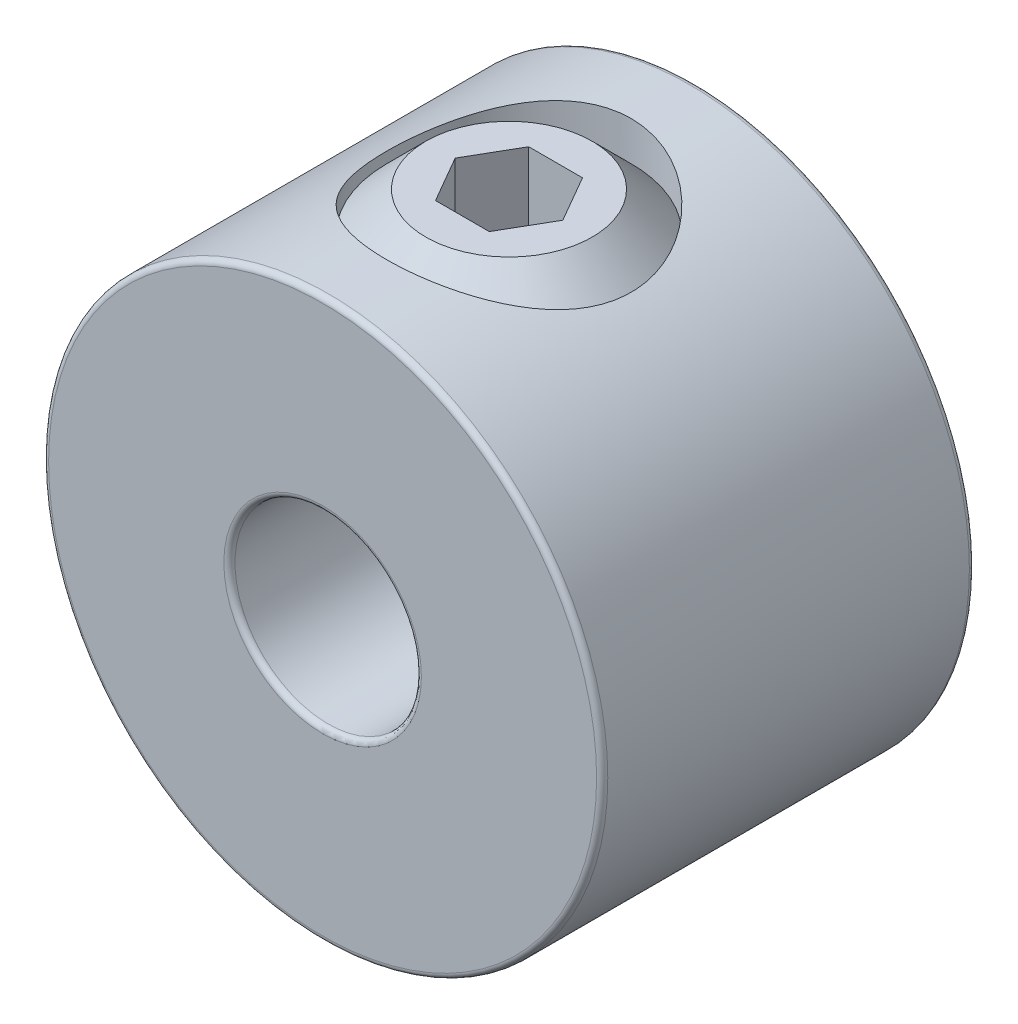
ISO-10303-21;
HEADER;
FILE_DESCRIPTION(('STEP AP214'),'2;1');
FILE_NAME('part.step','',(''),(''),'','','');
FILE_SCHEMA(('AUTOMOTIVE_DESIGN { 1 0 10303 214 1 1 1 1 }'));
ENDSEC;
DATA;
#1=APPLICATION_CONTEXT('core data for automotive mechanical design processes');
#2=APPLICATION_PROTOCOL_DEFINITION('international standard','automotive_design',2000,#1);
#3=PRODUCT_CONTEXT('',#1,'mechanical');
#4=PRODUCT('Part','Part','',(#3));
#5=PRODUCT_RELATED_PRODUCT_CATEGORY('part','',(#4));
#6=PRODUCT_DEFINITION_FORMATION('','',#4);
#7=PRODUCT_DEFINITION_CONTEXT('part definition',#1,'design');
#8=PRODUCT_DEFINITION('design','',#6,#7);
#9=PRODUCT_DEFINITION_SHAPE('','',#8);
#10=(LENGTH_UNIT() NAMED_UNIT(*) SI_UNIT(.MILLI.,.METRE.));
#11=(NAMED_UNIT(*) PLANE_ANGLE_UNIT() SI_UNIT($,.RADIAN.));
#12=(NAMED_UNIT(*) SI_UNIT($,.STERADIAN.) SOLID_ANGLE_UNIT());
#13=UNCERTAINTY_MEASURE_WITH_UNIT(LENGTH_MEASURE(1.E-05),#10,'distance_accuracy_value','');
#14=(GEOMETRIC_REPRESENTATION_CONTEXT(3) GLOBAL_UNCERTAINTY_ASSIGNED_CONTEXT((#13)) GLOBAL_UNIT_ASSIGNED_CONTEXT((#10,
#11,#12)) REPRESENTATION_CONTEXT('',''));
#15=CARTESIAN_POINT('',(0.,0.,0.));
#16=DIRECTION('',(0.,0.,1.));
#17=DIRECTION('',(1.,0.,0.));
#18=AXIS2_PLACEMENT_3D('',#15,#16,#17);
#19=CARTESIAN_POINT('',(0.,4.7625,0.));
#20=DIRECTION('',(0.,1.,0.));
#21=DIRECTION('',(-1.,0.,0.));
#22=AXIS2_PLACEMENT_3D('',#19,#20,#21);
#23=PLANE('',#22);
#24=CARTESIAN_POINT('',(0.,4.7625,0.));
#25=DIRECTION('',(0.,1.,0.));
#26=DIRECTION('',(-1.,0.,0.));
#27=AXIS2_PLACEMENT_3D('',#24,#25,#26);
#28=CIRCLE('',#27,1.41636774419345);
#29=CARTESIAN_POINT('',(-1.41636774419345,4.7625,0.));
#30=VERTEX_POINT('',#29);
#31=EDGE_CURVE('E12',#30,#30,#28,.T.);
#32=ORIENTED_EDGE('',*,*,#31,.T.);
#33=EDGE_LOOP('',(#32));
#34=FACE_BOUND('',#33,.T.);
#35=DIRECTION('',(1.,0.,0.));
#36=VECTOR('',#35,1.);
#37=CARTESIAN_POINT('',(-0.458271776169267,4.76249999999999,-0.793749999999997));
#38=LINE('',#37,#36);
#39=CARTESIAN_POINT('',(-0.458271776169267,4.76249999999999,-0.793749999999997));
#40=VERTEX_POINT('',#39);
#41=CARTESIAN_POINT('',(0.458271776169265,4.7625,-0.793749999999997));
#42=VERTEX_POINT('',#41);
#43=EDGE_CURVE('E117',#40,#42,#38,.T.);
#44=ORIENTED_EDGE('',*,*,#43,.T.);
#45=DIRECTION('',(0.5,0.,0.866025403784439));
#46=VECTOR('',#45,1.);
#47=CARTESIAN_POINT('',(0.458271776169265,4.76249999999999,-0.793749999999997));
#48=LINE('',#47,#46);
#49=CARTESIAN_POINT('',(0.91654355233853,4.76249999999999,0.));
#50=VERTEX_POINT('',#49);
#51=EDGE_CURVE('E63',#42,#50,#48,.T.);
#52=ORIENTED_EDGE('',*,*,#51,.T.);
#53=DIRECTION('',(-0.5,0.,0.866025403784439));
#54=VECTOR('',#53,1.);
#55=CARTESIAN_POINT('',(0.91654355233853,4.76249999999999,0.));
#56=LINE('',#55,#54);
#57=CARTESIAN_POINT('',(0.458271776169265,4.76249999999999,0.793750000000003));
#58=VERTEX_POINT('',#57);
#59=EDGE_CURVE('E121',#50,#58,#56,.T.);
#60=ORIENTED_EDGE('',*,*,#59,.T.);
#61=DIRECTION('',(-1.,0.,0.));
#62=VECTOR('',#61,1.);
#63=CARTESIAN_POINT('',(0.458271776169265,4.76249999999999,0.793750000000003));
#64=LINE('',#63,#62);
#65=CARTESIAN_POINT('',(-0.458271776169266,4.76249999999999,0.793750000000002));
#66=VERTEX_POINT('',#65);
#67=EDGE_CURVE('E186',#58,#66,#64,.T.);
#68=ORIENTED_EDGE('',*,*,#67,.T.);
#69=DIRECTION('',(-0.5,0.,-0.866025403784438));
#70=VECTOR('',#69,1.);
#71=CARTESIAN_POINT('',(-0.458271776169266,4.76249999999999,0.793750000000002));
#72=LINE('',#71,#70);
#73=CARTESIAN_POINT('',(-0.916543552338532,4.76249999999999,0.));
#74=VERTEX_POINT('',#73);
#75=EDGE_CURVE('E171',#66,#74,#72,.T.);
#76=ORIENTED_EDGE('',*,*,#75,.T.);
#77=DIRECTION('',(0.5,0.,-0.866025403784439));
#78=VECTOR('',#77,1.);
#79=CARTESIAN_POINT('',(-0.916543552338532,4.76249999999999,0.));
#80=LINE('',#79,#78);
#81=EDGE_CURVE('E167',#74,#40,#80,.T.);
#82=ORIENTED_EDGE('',*,*,#81,.T.);
#83=EDGE_LOOP('',(#44,#52,#60,#68,#76,#82));
#84=FACE_BOUND('',#83,.T.);
#85=ADVANCED_FACE('F49',(#34,#84),#23,.T.);
#86=CARTESIAN_POINT('',(0.,4.7625,0.));
#87=DIRECTION('',(0.,-1.,0.));
#88=DIRECTION('',(1.,0.,0.));
#89=AXIS2_PLACEMENT_3D('',#86,#87,#88);
#90=CONICAL_SURFACE('',#89,1.41636774419345,0.785398163397449);
#91=CARTESIAN_POINT('',(0.,4.09606774419345,0.));
#92=DIRECTION('',(0.,1.,0.));
#93=DIRECTION('',(-1.,0.,0.));
#94=AXIS2_PLACEMENT_3D('',#91,#92,#93);
#95=CIRCLE('',#94,2.0828);
#96=CARTESIAN_POINT('',(-2.0828,4.09606774419345,0.));
#97=VERTEX_POINT('',#96);
#98=EDGE_CURVE('E56',#97,#97,#95,.T.);
#99=ORIENTED_EDGE('',*,*,#98,.T.);
#100=EDGE_LOOP('',(#99));
#101=FACE_BOUND('',#100,.T.);
#102=ORIENTED_EDGE('',*,*,#31,.F.);
#103=EDGE_LOOP('',(#102));
#104=FACE_BOUND('',#103,.T.);
#105=ADVANCED_FACE('F139',(#101,#104),#90,.T.);
#106=CARTESIAN_POINT('',(0.,1.5875,0.));
#107=DIRECTION('',(0.,1.,0.));
#108=DIRECTION('',(-1.,0.,0.));
#109=AXIS2_PLACEMENT_3D('',#106,#107,#108);
#110=CYLINDRICAL_SURFACE('',#109,2.0828);
#111=CARTESIAN_POINT('',(0.,2.25393225580655,0.));
#112=DIRECTION('',(0.,1.,0.));
#113=DIRECTION('',(-1.,0.,0.));
#114=AXIS2_PLACEMENT_3D('',#111,#112,#113);
#115=CIRCLE('',#114,2.0828);
#116=CARTESIAN_POINT('',(-2.0828,2.25393225580655,0.));
#117=VERTEX_POINT('',#116);
#118=EDGE_CURVE('E134',#117,#117,#115,.T.);
#119=ORIENTED_EDGE('',*,*,#118,.T.);
#120=EDGE_LOOP('',(#119));
#121=FACE_BOUND('',#120,.T.);
#122=ORIENTED_EDGE('',*,*,#98,.F.);
#123=EDGE_LOOP('',(#122));
#124=FACE_BOUND('',#123,.T.);
#125=ADVANCED_FACE('F142',(#121,#124),#110,.T.);
#126=CARTESIAN_POINT('',(0.,2.25393225580655,0.));
#127=DIRECTION('',(0.,1.,0.));
#128=DIRECTION('',(-1.,0.,0.));
#129=AXIS2_PLACEMENT_3D('',#126,#127,#128);
#130=CONICAL_SURFACE('',#129,2.0828,0.785398163397448);
#131=CARTESIAN_POINT('',(0.,1.5875,0.));
#132=DIRECTION('',(0.,1.,0.));
#133=DIRECTION('',(-1.,0.,0.));
#134=AXIS2_PLACEMENT_3D('',#131,#132,#133);
#135=CIRCLE('',#134,1.41636774419345);
#136=CARTESIAN_POINT('',(-1.41636774419345,1.5875,0.));
#137=VERTEX_POINT('',#136);
#138=EDGE_CURVE('E126',#137,#137,#135,.T.);
#139=ORIENTED_EDGE('',*,*,#138,.T.);
#140=EDGE_LOOP('',(#139));
#141=FACE_BOUND('',#140,.T.);
#142=ORIENTED_EDGE('',*,*,#118,.F.);
#143=EDGE_LOOP('',(#142));
#144=FACE_BOUND('',#143,.T.);
#145=ADVANCED_FACE('F144',(#141,#144),#130,.T.);
#146=CARTESIAN_POINT('',(-1.41636774419345,1.5875,0.));
#147=DIRECTION('',(0.,-1.,0.));
#148=DIRECTION('',(1.,0.,0.));
#149=AXIS2_PLACEMENT_3D('',#146,#147,#148);
#150=PLANE('',#149);
#151=CARTESIAN_POINT('',(0.,1.5875,0.));
#152=DIRECTION('',(0.,1.,0.));
#153=DIRECTION('',(-1.,0.,0.));
#154=AXIS2_PLACEMENT_3D('',#151,#152,#153);
#155=CIRCLE('',#154,0.799718706967865);
#156=CARTESIAN_POINT('',(-0.799718706967865,1.5875,0.));
#157=VERTEX_POINT('',#156);
#158=EDGE_CURVE('E122',#157,#157,#155,.T.);
#159=ORIENTED_EDGE('',*,*,#158,.T.);
#160=EDGE_LOOP('',(#159));
#161=FACE_BOUND('',#160,.T.);
#162=ORIENTED_EDGE('',*,*,#138,.F.);
#163=EDGE_LOOP('',(#162));
#164=FACE_BOUND('',#163,.T.);
#165=ADVANCED_FACE('F151',(#161,#164),#150,.T.);
#166=CARTESIAN_POINT('',(0.,1.5875,0.));
#167=DIRECTION('',(0.,-1.,0.));
#168=DIRECTION('',(1.,0.,0.));
#169=AXIS2_PLACEMENT_3D('',#166,#167,#168);
#170=CONICAL_SURFACE('',#169,0.799718706967865,0.785398163397448);
#171=CARTESIAN_POINT('',(0.,2.38721870696786,0.));
#172=VERTEX_POINT('',#171);
#173=VERTEX_LOOP('',#172);
#174=FACE_BOUND('',#173,.T.);
#175=ORIENTED_EDGE('',*,*,#158,.F.);
#176=EDGE_LOOP('',(#175));
#177=FACE_BOUND('',#176,.T.);
#178=ADVANCED_FACE('F219',(#174,#177),#170,.F.);
#179=CARTESIAN_POINT('',(0.458271776169265,3.17499999999999,-0.793749999999997));
#180=DIRECTION('',(-0.866025403784439,0.,0.5));
#181=DIRECTION('',(0.5,0.,0.866025403784439));
#182=AXIS2_PLACEMENT_3D('',#179,#180,#181);
#183=PLANE('',#182);
#184=ORIENTED_EDGE('',*,*,#51,.F.);
#185=DIRECTION('',(0.,1.,0.));
#186=VECTOR('',#185,1.);
#187=CARTESIAN_POINT('',(0.458271776169265,3.17499999999999,-0.793749999999997));
#188=LINE('',#187,#186);
#189=CARTESIAN_POINT('',(0.458271776169265,3.17499999999999,-0.793749999999997));
#190=VERTEX_POINT('',#189);
#191=EDGE_CURVE('E116',#190,#42,#188,.T.);
#192=ORIENTED_EDGE('',*,*,#191,.F.);
#193=DIRECTION('',(0.5,0.,0.866025403784439));
#194=VECTOR('',#193,1.);
#195=CARTESIAN_POINT('',(0.458271776169265,3.17499999999999,-0.793749999999997));
#196=LINE('',#195,#194);
#197=CARTESIAN_POINT('',(0.91654355233853,3.17499999999999,0.));
#198=VERTEX_POINT('',#197);
#199=EDGE_CURVE('E107',#190,#198,#196,.T.);
#200=ORIENTED_EDGE('',*,*,#199,.T.);
#201=DIRECTION('',(0.,1.,0.));
#202=VECTOR('',#201,1.);
#203=CARTESIAN_POINT('',(0.91654355233853,3.17499999999999,0.));
#204=LINE('',#203,#202);
#205=EDGE_CURVE('E115',#198,#50,#204,.T.);
#206=ORIENTED_EDGE('',*,*,#205,.T.);
#207=EDGE_LOOP('',(#184,#192,#200,#206));
#208=FACE_BOUND('',#207,.T.);
#209=ADVANCED_FACE('F114',(#208),#183,.T.);
#210=CARTESIAN_POINT('',(0.91654355233853,3.17499999999999,0.));
#211=DIRECTION('',(-0.866025403784439,0.,-0.5));
#212=DIRECTION('',(-0.5,0.,0.866025403784439));
#213=AXIS2_PLACEMENT_3D('',#210,#211,#212);
#214=PLANE('',#213);
#215=ORIENTED_EDGE('',*,*,#59,.F.);
#216=ORIENTED_EDGE('',*,*,#205,.F.);
#217=DIRECTION('',(-0.5,0.,0.866025403784439));
#218=VECTOR('',#217,1.);
#219=CARTESIAN_POINT('',(0.91654355233853,3.17499999999999,0.));
#220=LINE('',#219,#218);
#221=CARTESIAN_POINT('',(0.458271776169265,3.17499999999999,0.793750000000003));
#222=VERTEX_POINT('',#221);
#223=EDGE_CURVE('E103',#198,#222,#220,.T.);
#224=ORIENTED_EDGE('',*,*,#223,.T.);
#225=DIRECTION('',(0.,1.,0.));
#226=VECTOR('',#225,1.);
#227=CARTESIAN_POINT('',(0.458271776169265,3.17499999999999,0.793750000000003));
#228=LINE('',#227,#226);
#229=EDGE_CURVE('E123',#222,#58,#228,.T.);
#230=ORIENTED_EDGE('',*,*,#229,.T.);
#231=EDGE_LOOP('',(#215,#216,#224,#230));
#232=FACE_BOUND('',#231,.T.);
#233=ADVANCED_FACE('F119',(#232),#214,.T.);
#234=CARTESIAN_POINT('',(0.458271776169265,3.17499999999999,0.793750000000003));
#235=DIRECTION('',(0.,0.,-1.));
#236=DIRECTION('',(-1.,0.,0.));
#237=AXIS2_PLACEMENT_3D('',#234,#235,#236);
#238=PLANE('',#237);
#239=ORIENTED_EDGE('',*,*,#67,.F.);
#240=ORIENTED_EDGE('',*,*,#229,.F.);
#241=DIRECTION('',(-1.,0.,0.));
#242=VECTOR('',#241,1.);
#243=CARTESIAN_POINT('',(0.458271776169265,3.17499999999999,0.793750000000003));
#244=LINE('',#243,#242);
#245=CARTESIAN_POINT('',(-0.458271776169266,3.17499999999999,0.793750000000002));
#246=VERTEX_POINT('',#245);
#247=EDGE_CURVE('E109',#222,#246,#244,.T.);
#248=ORIENTED_EDGE('',*,*,#247,.T.);
#249=DIRECTION('',(0.,1.,0.));
#250=VECTOR('',#249,1.);
#251=CARTESIAN_POINT('',(-0.458271776169266,3.17499999999999,0.793750000000002));
#252=LINE('',#251,#250);
#253=EDGE_CURVE('E128',#246,#66,#252,.T.);
#254=ORIENTED_EDGE('',*,*,#253,.T.);
#255=EDGE_LOOP('',(#239,#240,#248,#254));
#256=FACE_BOUND('',#255,.T.);
#257=ADVANCED_FACE('F184',(#256),#238,.T.);
#258=CARTESIAN_POINT('',(-0.458271776169266,3.17499999999999,0.793750000000002));
#259=DIRECTION('',(0.866025403784438,0.,-0.5));
#260=DIRECTION('',(-0.5,0.,-0.866025403784439));
#261=AXIS2_PLACEMENT_3D('',#258,#259,#260);
#262=PLANE('',#261);
#263=ORIENTED_EDGE('',*,*,#75,.F.);
#264=ORIENTED_EDGE('',*,*,#253,.F.);
#265=DIRECTION('',(-0.5,0.,-0.866025403784438));
#266=VECTOR('',#265,1.);
#267=CARTESIAN_POINT('',(-0.458271776169266,3.17499999999999,0.793750000000002));
#268=LINE('',#267,#266);
#269=CARTESIAN_POINT('',(-0.916543552338532,3.17499999999999,0.));
#270=VERTEX_POINT('',#269);
#271=EDGE_CURVE('E197',#246,#270,#268,.T.);
#272=ORIENTED_EDGE('',*,*,#271,.T.);
#273=DIRECTION('',(0.,1.,0.));
#274=VECTOR('',#273,1.);
#275=CARTESIAN_POINT('',(-0.916543552338532,3.17499999999999,0.));
#276=LINE('',#275,#274);
#277=EDGE_CURVE('E179',#270,#74,#276,.T.);
#278=ORIENTED_EDGE('',*,*,#277,.T.);
#279=EDGE_LOOP('',(#263,#264,#272,#278));
#280=FACE_BOUND('',#279,.T.);
#281=ADVANCED_FACE('F188',(#280),#262,.T.);
#282=CARTESIAN_POINT('',(-0.916543552338532,3.17499999999999,0.));
#283=DIRECTION('',(0.866025403784439,0.,0.5));
#284=DIRECTION('',(0.5,0.,-0.866025403784439));
#285=AXIS2_PLACEMENT_3D('',#282,#283,#284);
#286=PLANE('',#285);
#287=ORIENTED_EDGE('',*,*,#81,.F.);
#288=ORIENTED_EDGE('',*,*,#277,.F.);
#289=DIRECTION('',(0.5,0.,-0.866025403784439));
#290=VECTOR('',#289,1.);
#291=CARTESIAN_POINT('',(-0.916543552338532,3.17499999999999,0.));
#292=LINE('',#291,#290);
#293=CARTESIAN_POINT('',(-0.458271776169267,3.17499999999999,-0.793749999999997));
#294=VERTEX_POINT('',#293);
#295=EDGE_CURVE('E195',#270,#294,#292,.T.);
#296=ORIENTED_EDGE('',*,*,#295,.T.);
#297=DIRECTION('',(0.,1.,0.));
#298=VECTOR('',#297,1.);
#299=CARTESIAN_POINT('',(-0.458271776169267,3.17499999999999,-0.793749999999997));
#300=LINE('',#299,#298);
#301=EDGE_CURVE('E176',#294,#40,#300,.T.);
#302=ORIENTED_EDGE('',*,*,#301,.T.);
#303=EDGE_LOOP('',(#287,#288,#296,#302));
#304=FACE_BOUND('',#303,.T.);
#305=ADVANCED_FACE('F201',(#304),#286,.T.);
#306=CARTESIAN_POINT('',(-0.458271776169267,3.17499999999999,-0.793749999999997));
#307=DIRECTION('',(0.,0.,1.));
#308=DIRECTION('',(1.,0.,0.));
#309=AXIS2_PLACEMENT_3D('',#306,#307,#308);
#310=PLANE('',#309);
#311=ORIENTED_EDGE('',*,*,#43,.F.);
#312=ORIENTED_EDGE('',*,*,#301,.F.);
#313=DIRECTION('',(1.,0.,0.));
#314=VECTOR('',#313,1.);
#315=CARTESIAN_POINT('',(-0.458271776169267,3.17499999999999,-0.793749999999997));
#316=LINE('',#315,#314);
#317=EDGE_CURVE('E177',#294,#190,#316,.T.);
#318=ORIENTED_EDGE('',*,*,#317,.T.);
#319=ORIENTED_EDGE('',*,*,#191,.T.);
#320=EDGE_LOOP('',(#311,#312,#318,#319));
#321=FACE_BOUND('',#320,.T.);
#322=ADVANCED_FACE('F202',(#321),#310,.T.);
#323=CARTESIAN_POINT('',(0.,3.17499999999999,-1.5875));
#324=DIRECTION('',(0.,1.,0.));
#325=DIRECTION('',(0.,0.,1.));
#326=AXIS2_PLACEMENT_3D('',#323,#324,#325);
#327=PLANE('',#326);
#328=ORIENTED_EDGE('',*,*,#199,.F.);
#329=ORIENTED_EDGE('',*,*,#317,.F.);
#330=ORIENTED_EDGE('',*,*,#295,.F.);
#331=ORIENTED_EDGE('',*,*,#271,.F.);
#332=ORIENTED_EDGE('',*,*,#247,.F.);
#333=ORIENTED_EDGE('',*,*,#223,.F.);
#334=EDGE_LOOP('',(#328,#329,#330,#331,#332,#333));
#335=FACE_BOUND('',#334,.T.);
#336=ADVANCED_FACE('F105',(#335),#327,.T.);
#337=CLOSED_SHELL('',(#85,#105,#125,#145,#165,#178,#209,#233,#257,#281,#305,#322,#336));
#338=MANIFOLD_SOLID_BREP('B2',#337);
#339=CARTESIAN_POINT('',(0.,0.,3.175));
#340=DIRECTION('',(0.,0.,1.));
#341=DIRECTION('',(1.,0.,0.));
#342=AXIS2_PLACEMENT_3D('',#339,#340,#341);
#343=PLANE('',#342);
#344=CARTESIAN_POINT('',(0.,0.,3.175));
#345=DIRECTION('',(0.,0.,1.));
#346=DIRECTION('',(1.,0.,0.));
#347=AXIS2_PLACEMENT_3D('',#344,#345,#346);
#348=CIRCLE('',#347,1.68275);
#349=CARTESIAN_POINT('',(1.68275,0.,3.175));
#350=VERTEX_POINT('',#349);
#351=EDGE_CURVE('E381',#350,#350,#348,.F.);
#352=ORIENTED_EDGE('',*,*,#351,.T.);
#353=EDGE_LOOP('',(#352));
#354=FACE_BOUND('',#353,.T.);
#355=CARTESIAN_POINT('',(0.,0.,3.175));
#356=DIRECTION('',(0.,0.,1.));
#357=DIRECTION('',(1.,0.,0.));
#358=AXIS2_PLACEMENT_3D('',#355,#356,#357);
#359=CIRCLE('',#358,4.66725);
#360=CARTESIAN_POINT('',(4.66725,0.,3.175));
#361=VERTEX_POINT('',#360);
#362=EDGE_CURVE('E384',#361,#361,#359,.T.);
#363=ORIENTED_EDGE('',*,*,#362,.T.);
#364=EDGE_LOOP('',(#363));
#365=FACE_BOUND('',#364,.T.);
#366=ADVANCED_FACE('F278',(#354,#365),#343,.T.);
#367=CARTESIAN_POINT('',(0.,0.,-3.175));
#368=DIRECTION('',(0.,0.,1.));
#369=DIRECTION('',(1.,0.,0.));
#370=AXIS2_PLACEMENT_3D('',#367,#368,#369);
#371=PLANE('',#370);
#372=CARTESIAN_POINT('',(0.,0.,-3.175));
#373=DIRECTION('',(0.,0.,1.));
#374=DIRECTION('',(1.,0.,0.));
#375=AXIS2_PLACEMENT_3D('',#372,#373,#374);
#376=CIRCLE('',#375,1.68275);
#377=CARTESIAN_POINT('',(1.68275,0.,-3.175));
#378=VERTEX_POINT('',#377);
#379=EDGE_CURVE('E400',#378,#378,#376,.T.);
#380=ORIENTED_EDGE('',*,*,#379,.T.);
#381=EDGE_LOOP('',(#380));
#382=FACE_BOUND('',#381,.T.);
#383=CARTESIAN_POINT('',(0.,0.,-3.175));
#384=DIRECTION('',(0.,0.,1.));
#385=DIRECTION('',(1.,0.,0.));
#386=AXIS2_PLACEMENT_3D('',#383,#384,#385);
#387=CIRCLE('',#386,4.66725);
#388=CARTESIAN_POINT('',(4.66725,0.,-3.175));
#389=VERTEX_POINT('',#388);
#390=EDGE_CURVE('E403',#389,#389,#387,.F.);
#391=ORIENTED_EDGE('',*,*,#390,.T.);
#392=EDGE_LOOP('',(#391));
#393=FACE_BOUND('',#392,.T.);
#394=ADVANCED_FACE('F353',(#382,#393),#371,.F.);
#395=CARTESIAN_POINT('',(0.,0.,3.175));
#396=DIRECTION('',(0.,0.,-1.));
#397=DIRECTION('',(-1.,0.,0.));
#398=AXIS2_PLACEMENT_3D('',#395,#396,#397);
#399=CYLINDRICAL_SURFACE('',#398,4.7625);
#400=CARTESIAN_POINT('',(0.,0.,-3.07975));
#401=DIRECTION('',(0.,0.,1.));
#402=DIRECTION('',(1.,0.,0.));
#403=AXIS2_PLACEMENT_3D('',#400,#401,#402);
#404=CIRCLE('',#403,4.7625);
#405=CARTESIAN_POINT('',(4.7625,0.,-3.07975));
#406=VERTEX_POINT('',#405);
#407=EDGE_CURVE('E47',#406,#406,#404,.T.);
#408=ORIENTED_EDGE('',*,*,#407,.T.);
#409=EDGE_LOOP('',(#408));
#410=FACE_BOUND('',#409,.T.);
#411=CARTESIAN_POINT('',(0.,0.,3.07975));
#412=DIRECTION('',(0.,0.,1.));
#413=DIRECTION('',(1.,0.,0.));
#414=AXIS2_PLACEMENT_3D('',#411,#412,#413);
#415=CIRCLE('',#414,4.7625);
#416=CARTESIAN_POINT('',(4.7625,0.,3.07975));
#417=VERTEX_POINT('',#416);
#418=EDGE_CURVE('E286',#417,#417,#415,.F.);
#419=ORIENTED_EDGE('',*,*,#418,.T.);
#420=EDGE_LOOP('',(#419));
#421=FACE_BOUND('',#420,.T.);
#422=CARTESIAN_POINT('',(0.,4.7625,-2.0828));
#423=CARTESIAN_POINT('',(0.111071743653542,4.76249603683798,-2.08279511454019));
#424=CARTESIAN_POINT('',(0.222321981209684,4.75857075047714,-2.07386284884724));
#425=CARTESIAN_POINT('',(0.44163204752813,4.74326014196689,-2.03848302953371));
#426=CARTESIAN_POINT('',(0.549683347848137,4.73185647835827,-2.01199241060061));
#427=CARTESIAN_POINT('',(0.759075641824642,4.7028017052965,-1.94267235968527));
#428=CARTESIAN_POINT('',(0.860438815402187,4.68517262017172,-1.89990048656392));
#429=CARTESIAN_POINT('',(1.05444297980025,4.64536073563245,-1.79948474143014));
#430=CARTESIAN_POINT('',(1.14708611927771,4.6231790623039,-1.74184454620408));
#431=CARTESIAN_POINT('',(1.32619574297911,4.57511002512907,-1.61003985545174));
#432=CARTESIAN_POINT('',(1.41212894971673,4.54909352773982,-1.53519826357987));
#433=CARTESIAN_POINT('',(1.57069122617801,4.49681211039082,-1.37255123891813));
#434=CARTESIAN_POINT('',(1.64331261413432,4.47054705613312,-1.28473837332359));
#435=CARTESIAN_POINT('',(1.77718548713285,4.41910049192964,-1.0927508917876));
#436=CARTESIAN_POINT('',(1.83758288413799,4.39405989123975,-0.987938900088163));
#437=CARTESIAN_POINT('',(1.93965267630104,4.34997330262519,-0.76839674653208));
#438=CARTESIAN_POINT('',(1.98133567235285,4.33092392277086,-0.653672243714194));
#439=CARTESIAN_POINT('',(2.04253551397779,4.30238873246805,-0.423696863051076));
#440=CARTESIAN_POINT('',(2.06308358312361,4.29246082811126,-0.308777523916066));
#441=CARTESIAN_POINT('',(2.08463987832703,4.28203712029549,-0.0767266547426842));
#442=CARTESIAN_POINT('',(2.08566052842421,4.2815353196173,0.040403421252241));
#443=CARTESIAN_POINT('',(2.06890402974151,4.28965031049058,0.262769847892723));
#444=CARTESIAN_POINT('',(2.05273752581227,4.29748584669176,0.368162062558629));
#445=CARTESIAN_POINT('',(2.00478801183591,4.32006087723989,0.574552036914508));
#446=CARTESIAN_POINT('',(1.97300163554703,4.33480185974894,0.675548844239808));
#447=CARTESIAN_POINT('',(1.89408562418665,4.36986708620376,0.87295534667494));
#448=CARTESIAN_POINT('',(1.84663122587168,4.39030794585783,0.969213557296075));
#449=CARTESIAN_POINT('',(1.73795862832961,4.43444930703374,1.15279938929592));
#450=CARTESIAN_POINT('',(1.67673471928593,4.458151159207,1.24012328395491));
#451=CARTESIAN_POINT('',(1.5355152991307,4.50885047006117,1.41200269581225));
#452=CARTESIAN_POINT('',(1.45429620676035,4.53594828217284,1.49552632521228));
#453=CARTESIAN_POINT('',(1.27876496657885,4.58852439419557,1.64813395927907));
#454=CARTESIAN_POINT('',(1.18444911674085,4.61400223321385,1.71721386729299));
#455=CARTESIAN_POINT('',(0.98199315473799,4.66135005528445,1.84070142328266));
#456=CARTESIAN_POINT('',(0.873541867649991,4.68310019510073,1.89464833067304));
#457=CARTESIAN_POINT('',(0.647907883462879,4.71960237914975,1.98316213937343));
#458=CARTESIAN_POINT('',(0.530730563553071,4.73435869252319,2.01774086567294));
#459=CARTESIAN_POINT('',(0.29955813000625,4.75438789864071,2.06428227255898));
#460=CARTESIAN_POINT('',(0.185891496759438,4.76023920962634,2.07762721422875));
#461=CARTESIAN_POINT('',(-0.0422002334821483,4.76367688780338,2.08549375299993));
#462=CARTESIAN_POINT('',(-0.156625071558397,4.76126594457006,2.0800214755859));
#463=CARTESIAN_POINT('',(-0.376239500843618,4.74881910942428,2.05136058889142));
#464=CARTESIAN_POINT('',(-0.481587950692455,4.73921662092109,2.02917857508186));
#465=CARTESIAN_POINT('',(-0.686930546466433,4.71383524207829,1.96916956922145));
#466=CARTESIAN_POINT('',(-0.786924032776088,4.69805559282654,1.93134065479507));
#467=CARTESIAN_POINT('',(-0.982261063048847,4.66119752506809,1.83989504938421));
#468=CARTESIAN_POINT('',(-1.07736167728556,4.63996894204687,1.78582197069));
#469=CARTESIAN_POINT('',(-1.25748262320955,4.59443017780039,1.6639208402943));
#470=CARTESIAN_POINT('',(-1.34249857280958,4.57011866637559,1.59608684350934));
#471=CARTESIAN_POINT('',(-1.50704626884199,4.51865251251798,1.44239782605641));
#472=CARTESIAN_POINT('',(-1.58562810518119,4.4914242669029,1.35554792805158));
#473=CARTESIAN_POINT('',(-1.72740709734185,4.43882896395537,1.16953050819299));
#474=CARTESIAN_POINT('',(-1.7905993443691,4.41346250227109,1.07035907134913));
#475=CARTESIAN_POINT('',(-1.90090710616626,4.36710736891284,0.859669195288205));
#476=CARTESIAN_POINT('',(-1.94765867230782,4.34622137271274,0.747935873022526));
#477=CARTESIAN_POINT('',(-2.0212491556326,4.31249652288353,0.516972846718103));
#478=CARTESIAN_POINT('',(-2.04810675798185,4.29965011992725,0.397750291343308));
#479=CARTESIAN_POINT('',(-2.07920462806254,4.28469192309432,0.165832281285445));
#480=CARTESIAN_POINT('',(-2.08513454186304,4.28177887329684,0.0534145265093577));
#481=CARTESIAN_POINT('',(-2.07881197591436,4.28485257647482,-0.170771928973274));
#482=CARTESIAN_POINT('',(-2.06656305470401,4.29083758763964,-0.282540752409963));
#483=CARTESIAN_POINT('',(-2.02569515637557,4.31027001020765,-0.49571627082683));
#484=CARTESIAN_POINT('',(-1.99803909507488,4.323277191827,-0.597351771351678));
#485=CARTESIAN_POINT('',(-1.92813811730661,4.3548998918002,-0.794537542165885));
#486=CARTESIAN_POINT('',(-1.88588901568722,4.37351701883994,-0.89008605744196));
#487=CARTESIAN_POINT('',(-1.78494166316609,4.41571713998097,-1.07899211066855));
#488=CARTESIAN_POINT('',(-1.725372741989,4.43953957729138,-1.17182974435804));
#489=CARTESIAN_POINT('',(-1.59263020348555,4.48886909674828,-1.34671742038427));
#490=CARTESIAN_POINT('',(-1.5194511400755,4.51437685062871,-1.42876312182485));
#491=CARTESIAN_POINT('',(-1.35432770524478,4.56676110448629,-1.58681338482294));
#492=CARTESIAN_POINT('',(-1.26132618509931,4.59357384118389,-1.6617400539749));
#493=CARTESIAN_POINT('',(-1.06311311198694,4.6434498649562,-1.79502220381804));
#494=CARTESIAN_POINT('',(-0.957896042231122,4.66651144655632,-1.85337015589629));
#495=CARTESIAN_POINT('',(-0.739382134093289,4.70604817448379,-1.95076869953943));
#496=CARTESIAN_POINT('',(-0.626206683784868,4.72260425373065,-1.99005794004707));
#497=CARTESIAN_POINT('',(-0.394140312369526,4.74758674320463,-2.04864429899602));
#498=CARTESIAN_POINT('',(-0.275268139656886,4.75603812476299,-2.06800283944244));
#499=CARTESIAN_POINT('',(-0.129794269471647,4.76080263074086,-2.07891545879212));
#500=CARTESIAN_POINT('',(-0.103863601552121,4.76143809774343,-2.08037086112351));
#501=CARTESIAN_POINT('',(-0.0519585455601014,4.76228724785877,-2.08231370757314));
#502=CARTESIAN_POINT('',(-0.025984157092933,4.76250092714331,-2.08280114290593));
#503=CARTESIAN_POINT('',(0.,4.7625,-2.0828));
#504=B_SPLINE_CURVE_WITH_KNOTS('',3,(#422,#423,#424,#425,#426,#427,#428,#429,#430,#431,#432,
#433,#434,#435,#436,#437,#438,#439,#440,#441,#442,#443,#444,#445,#446,#447,#448,#449,#450,#451,
#452,#453,#454,#455,#456,#457,#458,#459,#460,#461,#462,#463,#464,#465,#466,#467,#468,#469,#470,
#471,#472,#473,#474,#475,#476,#477,#478,#479,#480,#481,#482,#483,#484,#485,#486,#487,#488,#489,
#490,#491,#492,#493,#494,#495,#496,#497,#498,#499,#500,#501,#502,#503),.UNSPECIFIED.,.T.,.F.,(4,
2,2,2,2,2,2,2,2,2,2,2,2,2,2,2,2,2,2,2,2,2,2,2,2,2,2,2,2,2,2,2,2,2,2,2,2,2,2,2,4),(0.,
0.33310820401824,0.667036459729852,0.999794986340983,1.33247130387411,1.68162667549892,
2.03098290203732,2.39971700590033,2.7682419735897,3.11778335773632,3.46710234380304,
3.78635020510975,4.10566689777941,4.43206803194443,4.75860476556179,5.11583708198563,
5.47317058268738,5.84042760868038,6.2074601656107,6.54944714283841,6.89132280512613,
7.21410342298589,7.5369237094021,7.86983121571278,8.2028828544175,8.56199956317258,
8.92123066925855,9.28797626701619,9.65437696508207,9.99041826400208,10.3263937909242,
10.6434074032701,10.9605120078414,11.2976529734516,11.6349291370471,12.000392010648,
12.3660205814544,12.7269444065746,13.0867525844208,13.16467931051,13.2426067438737),.UNSPECIFIED.);
#505=CARTESIAN_POINT('',(0.,4.7625,-2.0828));
#506=VERTEX_POINT('',#505);
#507=EDGE_CURVE('E312',#506,#506,#504,.T.);
#508=ORIENTED_EDGE('',*,*,#507,.T.);
#509=EDGE_LOOP('',(#508));
#510=FACE_BOUND('',#509,.T.);
#511=ADVANCED_FACE('F348',(#410,#421,#510),#399,.T.);
#512=CARTESIAN_POINT('',(0.,0.,3.175));
#513=DIRECTION('',(0.,0.,-1.));
#514=DIRECTION('',(-1.,0.,0.));
#515=AXIS2_PLACEMENT_3D('',#512,#513,#514);
#516=CYLINDRICAL_SURFACE('',#515,1.5875);
#517=CARTESIAN_POINT('',(0.,0.,-3.07975));
#518=DIRECTION('',(0.,0.,1.));
#519=DIRECTION('',(1.,0.,0.));
#520=AXIS2_PLACEMENT_3D('',#517,#518,#519);
#521=CIRCLE('',#520,1.5875);
#522=CARTESIAN_POINT('',(1.5875,0.,-3.07975));
#523=VERTEX_POINT('',#522);
#524=EDGE_CURVE('E386',#523,#523,#521,.F.);
#525=ORIENTED_EDGE('',*,*,#524,.T.);
#526=EDGE_LOOP('',(#525));
#527=FACE_BOUND('',#526,.T.);
#528=CARTESIAN_POINT('',(0.,0.,3.07975));
#529=DIRECTION('',(0.,0.,1.));
#530=DIRECTION('',(1.,0.,0.));
#531=AXIS2_PLACEMENT_3D('',#528,#529,#530);
#532=CIRCLE('',#531,1.5875);
#533=CARTESIAN_POINT('',(1.5875,0.,3.07975));
#534=VERTEX_POINT('',#533);
#535=EDGE_CURVE('E390',#534,#534,#532,.T.);
#536=ORIENTED_EDGE('',*,*,#535,.T.);
#537=EDGE_LOOP('',(#536));
#538=FACE_BOUND('',#537,.T.);
#539=DIRECTION('',(0.,0.,-1.));
#540=VECTOR('',#539,1.);
#541=CARTESIAN_POINT('',(-1.5875,0.,3.175));
#542=LINE('',#541,#540);
#543=CARTESIAN_POINT('',(-1.5875,0.,1.34829506785422));
#544=VERTEX_POINT('',#543);
#545=CARTESIAN_POINT('',(-1.5875,0.,-1.34829506785421));
#546=VERTEX_POINT('',#545);
#547=EDGE_CURVE('E299',#544,#546,#542,.T.);
#548=ORIENTED_EDGE('',*,*,#547,.F.);
#549=CARTESIAN_POINT('',(1.5875,0.,1.34829506785422));
#550=CARTESIAN_POINT('',(1.58751250167526,0.0371796749147055,1.34826321274444));
#551=CARTESIAN_POINT('',(1.58619448834938,0.0743368152597562,1.34983214466503));
#552=CARTESIAN_POINT('',(1.5810010783066,0.148143074735686,1.35592016207092));
#553=CARTESIAN_POINT('',(1.57713173107453,0.184793186717817,1.36043226870369));
#554=CARTESIAN_POINT('',(1.56701045178817,0.256789309024742,1.37207453397196));
#555=CARTESIAN_POINT('',(1.56079296373217,0.292146429453895,1.37916679256343));
#556=CARTESIAN_POINT('',(1.54611731101487,0.361866984859766,1.39560020965857));
#557=CARTESIAN_POINT('',(1.53765771843849,0.396229771057219,1.40494280097058));
#558=CARTESIAN_POINT('',(1.50503567667222,0.512154357741266,1.44016352212742));
#559=CARTESIAN_POINT('',(1.47571907048682,0.59093081639414,1.47058051988037));
#560=CARTESIAN_POINT('',(1.40626180974019,0.74128980345641,1.53714447955401));
#561=CARTESIAN_POINT('',(1.36605712251335,0.812826220569202,1.57332479990027));
#562=CARTESIAN_POINT('',(1.27471294209353,0.949831207604798,1.64825226441898));
#563=CARTESIAN_POINT('',(1.22334959214916,1.01512888617247,1.6870386570649));
#564=CARTESIAN_POINT('',(1.11072352096978,1.13724834257517,1.76322598026328));
#565=CARTESIAN_POINT('',(1.04947866931705,1.19408507090069,1.80062926467946));
#566=CARTESIAN_POINT('',(0.920098012279939,1.29617705938076,1.86992936668842));
#567=CARTESIAN_POINT('',(0.852356956311658,1.34181694576755,1.90199094223696));
#568=CARTESIAN_POINT('',(0.708642575009259,1.42294443446725,1.96006859265411));
#569=CARTESIAN_POINT('',(0.63267531733348,1.4584394502612,1.9860890794945));
#570=CARTESIAN_POINT('',(0.485776321743824,1.51306682465208,2.02657068395719));
#571=CARTESIAN_POINT('',(0.415776890074109,1.53384789297439,2.04217561064641));
#572=CARTESIAN_POINT('',(0.272406446490129,1.5656728294411,2.06618501990694));
#573=CARTESIAN_POINT('',(0.199037706908504,1.57672316160553,2.07459428237296));
#574=CARTESIAN_POINT('',(0.0507808964223539,1.58843334298424,2.08350793580315));
#575=CARTESIAN_POINT('',(-0.0241108013047271,1.58906450189512,2.08399049974052));
#576=CARTESIAN_POINT('',(-0.172861420881534,1.57981967780449,2.07694993537512));
#577=CARTESIAN_POINT('',(-0.246720175517261,1.56994201312079,2.06942552575051));
#578=CARTESIAN_POINT('',(-0.388279389604075,1.5409114047944,2.04749165662268));
#579=CARTESIAN_POINT('',(-0.456108145480459,1.52215233413765,2.03337488787617));
#580=CARTESIAN_POINT('',(-0.587406185721684,1.47646448752226,1.9994034600223));
#581=CARTESIAN_POINT('',(-0.650874396840001,1.44953370905982,1.97954739453806));
#582=CARTESIAN_POINT('',(-0.778997392705316,1.38527569071757,1.93296296376559));
#583=CARTESIAN_POINT('',(-0.843063822688289,1.34714863740529,1.90572902003637));
#584=CARTESIAN_POINT('',(-0.964120968561195,1.26335095857154,1.84744383799956));
#585=CARTESIAN_POINT('',(-1.02110696044344,1.21767534355788,1.81639007834271));
#586=CARTESIAN_POINT('',(-1.138346768057,1.10989755314037,1.7457911397389));
#587=CARTESIAN_POINT('',(-1.19698345673507,1.04633627240133,1.70578807059375));
#588=CARTESIAN_POINT('',(-1.30337353234163,0.910405907181486,1.62594395211023));
#589=CARTESIAN_POINT('',(-1.35111220101286,0.8380251114172,1.58610319242377));
#590=CARTESIAN_POINT('',(-1.42741004189136,0.698426743054093,1.51746534180557));
#591=CARTESIAN_POINT('',(-1.45787222459685,0.632598929333557,1.48796717045657));
#592=CARTESIAN_POINT('',(-1.50995014211112,0.495521491760589,1.43508838350889));
#593=CARTESIAN_POINT('',(-1.53161249138607,0.424302872288943,1.41167577579928));
#594=CARTESIAN_POINT('',(-1.56099054933736,0.294557807475359,1.37903370499662));
#595=CARTESIAN_POINT('',(-1.57079832030287,0.237043588970557,1.3677550011357));
#596=CARTESIAN_POINT('',(-1.58074899735265,0.149236681139509,1.35621282019037));
#597=CARTESIAN_POINT('',(-1.58327288134711,0.119547825026616,1.35326030204234));
#598=CARTESIAN_POINT('',(-1.58665131905841,0.0599112815862893,1.34929476943376));
#599=CARTESIAN_POINT('',(-1.58750384339394,0.0299633238939952,1.3482841128302));
#600=CARTESIAN_POINT('',(-1.5875,0.,1.34829506785422));
#601=B_SPLINE_CURVE_WITH_KNOTS('',3,(#549,#550,#551,#552,#553,#554,#555,#556,#557,#558,#559,
#560,#561,#562,#563,#564,#565,#566,#567,#568,#569,#570,#571,#572,#573,#574,#575,#576,#577,#578,
#579,#580,#581,#582,#583,#584,#585,#586,#587,#588,#589,#590,#591,#592,#593,#594,#595,#596,#597,
#598,#599,#600),.UNSPECIFIED.,.F.,.F.,(4,2,2,2,2,2,2,2,2,2,2,2,2,2,2,2,2,2,2,2,2,2,2,2,2,4),(0.,
0.111446436260419,0.222629566829427,0.332241432902638,0.441923275245671,0.708474779801608,
0.976629253003099,1.25076368732977,1.52440782517585,1.78662051715592,2.0486411013861,
2.27167947822604,2.49456958113516,2.71807333362329,2.94161285784332,3.1560541708532,
3.37054807590767,3.60779585858109,3.84520109051919,4.1299808725199,4.41514301634629,
4.64933235125087,4.88226443370479,5.05977123890358,5.14949546424099,5.23932856630523),.UNSPECIFIED.);
#602=CARTESIAN_POINT('',(1.5875,0.,1.34829506785422));
#603=VERTEX_POINT('',#602);
#604=EDGE_CURVE('E311',#603,#544,#601,.T.);
#605=ORIENTED_EDGE('',*,*,#604,.F.);
#606=DIRECTION('',(0.,0.,-1.));
#607=VECTOR('',#606,1.);
#608=CARTESIAN_POINT('',(1.5875,0.,3.175));
#609=LINE('',#608,#607);
#610=CARTESIAN_POINT('',(1.5875,0.,-1.34829506785421));
#611=VERTEX_POINT('',#610);
#612=EDGE_CURVE('E306',#611,#603,#609,.F.);
#613=ORIENTED_EDGE('',*,*,#612,.F.);
#614=CARTESIAN_POINT('',(-1.5875,0.,-1.34829506785421));
#615=CARTESIAN_POINT('',(-1.58751250167526,0.0371796749147055,-1.34826321274443));
#616=CARTESIAN_POINT('',(-1.58619448834938,0.0743368152597562,-1.34983214466503));
#617=CARTESIAN_POINT('',(-1.5810010783066,0.148143074735686,-1.35592016207092));
#618=CARTESIAN_POINT('',(-1.57713173107453,0.184793186717817,-1.36043226870368));
#619=CARTESIAN_POINT('',(-1.56701045178817,0.256789309024742,-1.37207453397196));
#620=CARTESIAN_POINT('',(-1.56079296373217,0.292146429453895,-1.37916679256342));
#621=CARTESIAN_POINT('',(-1.54611731101487,0.361866984859766,-1.39560020965856));
#622=CARTESIAN_POINT('',(-1.53765771843849,0.396229771057219,-1.40494280097057));
#623=CARTESIAN_POINT('',(-1.50503567667222,0.512154357741266,-1.44016352212741));
#624=CARTESIAN_POINT('',(-1.47571907048682,0.59093081639414,-1.47058051988036));
#625=CARTESIAN_POINT('',(-1.40626180974019,0.74128980345641,-1.53714447955401));
#626=CARTESIAN_POINT('',(-1.36605712251335,0.812826220569202,-1.57332479990027));
#627=CARTESIAN_POINT('',(-1.27471294209353,0.949831207604799,-1.64825226441897));
#628=CARTESIAN_POINT('',(-1.22334959214916,1.01512888617247,-1.68703865706489));
#629=CARTESIAN_POINT('',(-1.11072352096978,1.13724834257517,-1.76322598026328));
#630=CARTESIAN_POINT('',(-1.04947866931705,1.19408507090069,-1.80062926467945));
#631=CARTESIAN_POINT('',(-0.920098012279939,1.29617705938076,-1.86992936668842));
#632=CARTESIAN_POINT('',(-0.852356956311657,1.34181694576755,-1.90199094223695));
#633=CARTESIAN_POINT('',(-0.708642575009259,1.42294443446725,-1.9600685926541));
#634=CARTESIAN_POINT('',(-0.63267531733348,1.4584394502612,-1.98608907949449));
#635=CARTESIAN_POINT('',(-0.485776321743824,1.51306682465208,-2.02657068395718));
#636=CARTESIAN_POINT('',(-0.415776890074109,1.53384789297439,-2.04217561064641));
#637=CARTESIAN_POINT('',(-0.272406446490129,1.5656728294411,-2.06618501990694));
#638=CARTESIAN_POINT('',(-0.199037706908504,1.57672316160553,-2.07459428237295));
#639=CARTESIAN_POINT('',(-0.0507808964223539,1.58843334298424,-2.08350793580315));
#640=CARTESIAN_POINT('',(0.0241108013047271,1.58906450189512,-2.08399049974051));
#641=CARTESIAN_POINT('',(0.172861420881534,1.57981967780449,-2.07694993537511));
#642=CARTESIAN_POINT('',(0.246720175517261,1.56994201312079,-2.06942552575051));
#643=CARTESIAN_POINT('',(0.388279389604075,1.5409114047944,-2.04749165662267));
#644=CARTESIAN_POINT('',(0.456108145480459,1.52215233413765,-2.03337488787616));
#645=CARTESIAN_POINT('',(0.587406185721684,1.47646448752226,-1.99940346002229));
#646=CARTESIAN_POINT('',(0.650874396840001,1.44953370905982,-1.97954739453805));
#647=CARTESIAN_POINT('',(0.778997392705316,1.38527569071757,-1.93296296376558));
#648=CARTESIAN_POINT('',(0.843063822688289,1.34714863740529,-1.90572902003636));
#649=CARTESIAN_POINT('',(0.964120968561195,1.26335095857154,-1.84744383799955));
#650=CARTESIAN_POINT('',(1.02110696044344,1.21767534355788,-1.8163900783427));
#651=CARTESIAN_POINT('',(1.138346768057,1.10989755314037,-1.74579113973889));
#652=CARTESIAN_POINT('',(1.19698345673507,1.04633627240133,-1.70578807059375));
#653=CARTESIAN_POINT('',(1.30337353234163,0.910405907181486,-1.62594395211022));
#654=CARTESIAN_POINT('',(1.35111220101286,0.8380251114172,-1.58610319242376));
#655=CARTESIAN_POINT('',(1.42741004189136,0.698426743054093,-1.51746534180557));
#656=CARTESIAN_POINT('',(1.45787222459685,0.632598929333557,-1.48796717045657));
#657=CARTESIAN_POINT('',(1.50995014211112,0.495521491760589,-1.43508838350888));
#658=CARTESIAN_POINT('',(1.53161249138607,0.424302872288943,-1.41167577579927));
#659=CARTESIAN_POINT('',(1.56099054933736,0.294557807475359,-1.37903370499662));
#660=CARTESIAN_POINT('',(1.57079832030287,0.237043588970557,-1.36775500113569));
#661=CARTESIAN_POINT('',(1.58074899735265,0.149236681139509,-1.35621282019036));
#662=CARTESIAN_POINT('',(1.58327288134711,0.119547825026616,-1.35326030204234));
#663=CARTESIAN_POINT('',(1.58665131905841,0.0599112815862893,-1.34929476943376));
#664=CARTESIAN_POINT('',(1.58750384339394,0.0299633238939952,-1.3482841128302));
#665=CARTESIAN_POINT('',(1.5875,0.,-1.34829506785422));
#666=B_SPLINE_CURVE_WITH_KNOTS('',3,(#614,#615,#616,#617,#618,#619,#620,#621,#622,#623,#624,
#625,#626,#627,#628,#629,#630,#631,#632,#633,#634,#635,#636,#637,#638,#639,#640,#641,#642,#643,
#644,#645,#646,#647,#648,#649,#650,#651,#652,#653,#654,#655,#656,#657,#658,#659,#660,#661,#662,
#663,#664,#665),.UNSPECIFIED.,.F.,.F.,(4,2,2,2,2,2,2,2,2,2,2,2,2,2,2,2,2,2,2,2,2,2,2,2,2,4),(0.,
0.111446436260419,0.222629566829427,0.332241432902638,0.441923275245671,0.708474779801608,
0.976629253003099,1.25076368732977,1.52440782517585,1.78662051715592,2.0486411013861,
2.27167947822604,2.49456958113516,2.71807333362329,2.94161285784332,3.1560541708532,
3.37054807590767,3.60779585858109,3.84520109051919,4.1299808725199,4.41514301634629,
4.64933235125087,4.88226443370479,5.05977123890358,5.14949546424099,5.23932856630523),.UNSPECIFIED.);
#667=EDGE_CURVE('E317',#546,#611,#666,.T.);
#668=ORIENTED_EDGE('',*,*,#667,.F.);
#669=EDGE_LOOP('',(#548,#605,#613,#668));
#670=FACE_BOUND('',#669,.T.);
#671=ADVANCED_FACE('F320',(#527,#538,#670),#516,.F.);
#672=CARTESIAN_POINT('',(0.,4.7625,0.));
#673=DIRECTION('',(0.,-1.,0.));
#674=DIRECTION('',(0.,0.,-1.));
#675=AXIS2_PLACEMENT_3D('',#672,#673,#674);
#676=CYLINDRICAL_SURFACE('',#675,2.0828);
#677=ORIENTED_EDGE('',*,*,#667,.T.);
#678=CARTESIAN_POINT('',(0.,0.,0.));
#679=DIRECTION('',(0.,-1.,0.));
#680=DIRECTION('',(0.,0.,-1.));
#681=AXIS2_PLACEMENT_3D('',#678,#679,#680);
#682=CIRCLE('',#681,2.0828);
#683=EDGE_CURVE('E292',#611,#603,#682,.T.);
#684=ORIENTED_EDGE('',*,*,#683,.T.);
#685=ORIENTED_EDGE('',*,*,#604,.T.);
#686=EDGE_CURVE('E318',#544,#546,#682,.T.);
#687=ORIENTED_EDGE('',*,*,#686,.T.);
#688=EDGE_LOOP('',(#677,#684,#685,#687));
#689=FACE_BOUND('',#688,.T.);
#690=ORIENTED_EDGE('',*,*,#507,.F.);
#691=EDGE_LOOP('',(#690));
#692=FACE_BOUND('',#691,.T.);
#693=ADVANCED_FACE('F315',(#689,#692),#676,.F.);
#694=CARTESIAN_POINT('',(0.,0.,0.));
#695=DIRECTION('',(0.,-1.,0.));
#696=DIRECTION('',(0.,0.,-1.));
#697=AXIS2_PLACEMENT_3D('',#694,#695,#696);
#698=PLANE('',#697);
#699=ORIENTED_EDGE('',*,*,#547,.T.);
#700=ORIENTED_EDGE('',*,*,#686,.F.);
#701=EDGE_LOOP('',(#699,#700));
#702=FACE_BOUND('',#701,.T.);
#703=ADVANCED_FACE('F340',(#702),#698,.F.);
#704=ORIENTED_EDGE('',*,*,#612,.T.);
#705=ORIENTED_EDGE('',*,*,#683,.F.);
#706=EDGE_LOOP('',(#704,#705));
#707=FACE_BOUND('',#706,.T.);
#708=ADVANCED_FACE('F307',(#707),#698,.F.);
#709=CARTESIAN_POINT('',(0.,0.,-3.07975));
#710=DIRECTION('',(0.,0.,1.));
#711=DIRECTION('',(1.,0.,0.));
#712=AXIS2_PLACEMENT_3D('',#709,#710,#711);
#713=TOROIDAL_SURFACE('',#712,1.68275,0.09525);
#714=ORIENTED_EDGE('',*,*,#524,.F.);
#715=EDGE_LOOP('',(#714));
#716=FACE_BOUND('',#715,.T.);
#717=ORIENTED_EDGE('',*,*,#379,.F.);
#718=EDGE_LOOP('',(#717));
#719=FACE_BOUND('',#718,.T.);
#720=ADVANCED_FACE('F355',(#716,#719),#713,.T.);
#721=CARTESIAN_POINT('',(0.,0.,3.07975));
#722=DIRECTION('',(0.,0.,1.));
#723=DIRECTION('',(1.,0.,0.));
#724=AXIS2_PLACEMENT_3D('',#721,#722,#723);
#725=TOROIDAL_SURFACE('',#724,1.68275,0.09525);
#726=ORIENTED_EDGE('',*,*,#351,.F.);
#727=EDGE_LOOP('',(#726));
#728=FACE_BOUND('',#727,.T.);
#729=ORIENTED_EDGE('',*,*,#535,.F.);
#730=EDGE_LOOP('',(#729));
#731=FACE_BOUND('',#730,.T.);
#732=ADVANCED_FACE('F358',(#728,#731),#725,.T.);
#733=CARTESIAN_POINT('',(0.,0.,-3.07975));
#734=DIRECTION('',(0.,0.,1.));
#735=DIRECTION('',(1.,0.,0.));
#736=AXIS2_PLACEMENT_3D('',#733,#734,#735);
#737=TOROIDAL_SURFACE('',#736,4.66725,0.09525);
#738=ORIENTED_EDGE('',*,*,#390,.F.);
#739=EDGE_LOOP('',(#738));
#740=FACE_BOUND('',#739,.T.);
#741=ORIENTED_EDGE('',*,*,#407,.F.);
#742=EDGE_LOOP('',(#741));
#743=FACE_BOUND('',#742,.T.);
#744=ADVANCED_FACE('F361',(#740,#743),#737,.T.);
#745=CARTESIAN_POINT('',(0.,0.,3.07975));
#746=DIRECTION('',(0.,0.,1.));
#747=DIRECTION('',(1.,0.,0.));
#748=AXIS2_PLACEMENT_3D('',#745,#746,#747);
#749=TOROIDAL_SURFACE('',#748,4.66725,0.09525);
#750=ORIENTED_EDGE('',*,*,#418,.F.);
#751=EDGE_LOOP('',(#750));
#752=FACE_BOUND('',#751,.T.);
#753=ORIENTED_EDGE('',*,*,#362,.F.);
#754=EDGE_LOOP('',(#753));
#755=FACE_BOUND('',#754,.T.);
#756=ADVANCED_FACE('F280',(#752,#755),#749,.T.);
#757=CLOSED_SHELL('',(#366,#394,#511,#671,#693,#703,#708,#720,#732,#744,#756));
#758=MANIFOLD_SOLID_BREP('B6',#757);
#759=ADVANCED_BREP_SHAPE_REPRESENTATION('',(#18,#338,#758),#14);
#760=SHAPE_DEFINITION_REPRESENTATION(#9,#759);
ENDSEC;
END-ISO-10303-21;
